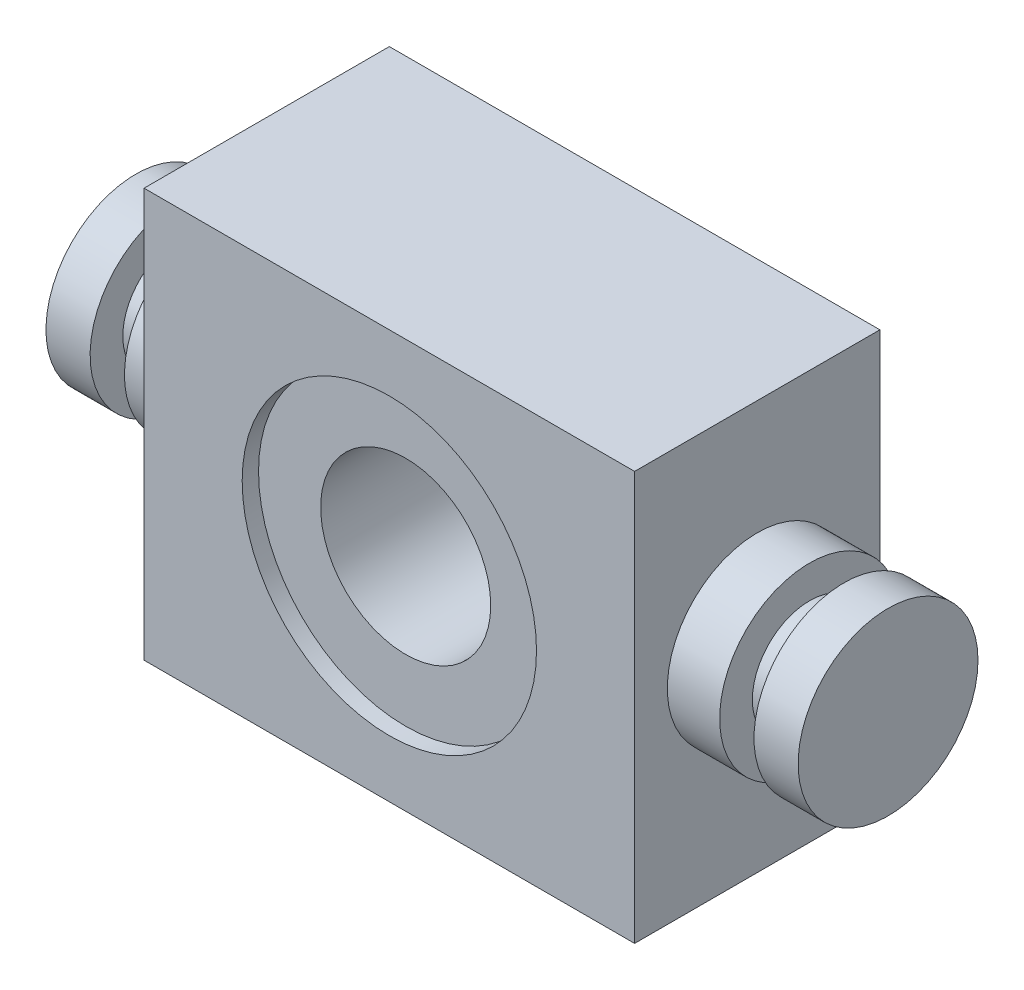
ISO-10303-21;
HEADER;
FILE_DESCRIPTION(('STEP AP214'),'2;1');
FILE_NAME('part.step','',(''),(''),'','','');
FILE_SCHEMA(('AUTOMOTIVE_DESIGN { 1 0 10303 214 1 1 1 1 }'));
ENDSEC;
DATA;
#1=APPLICATION_CONTEXT('core data for automotive mechanical design processes');
#2=APPLICATION_PROTOCOL_DEFINITION('international standard','automotive_design',2000,#1);
#3=PRODUCT_CONTEXT('',#1,'mechanical');
#4=PRODUCT('Part','Part','',(#3));
#5=PRODUCT_RELATED_PRODUCT_CATEGORY('part','',(#4));
#6=PRODUCT_DEFINITION_FORMATION('','',#4);
#7=PRODUCT_DEFINITION_CONTEXT('part definition',#1,'design');
#8=PRODUCT_DEFINITION('design','',#6,#7);
#9=PRODUCT_DEFINITION_SHAPE('','',#8);
#10=(LENGTH_UNIT() NAMED_UNIT(*) SI_UNIT(.MILLI.,.METRE.));
#11=(NAMED_UNIT(*) PLANE_ANGLE_UNIT() SI_UNIT($,.RADIAN.));
#12=(NAMED_UNIT(*) SI_UNIT($,.STERADIAN.) SOLID_ANGLE_UNIT());
#13=UNCERTAINTY_MEASURE_WITH_UNIT(LENGTH_MEASURE(1.E-05),#10,'distance_accuracy_value','');
#14=(GEOMETRIC_REPRESENTATION_CONTEXT(3) GLOBAL_UNCERTAINTY_ASSIGNED_CONTEXT((#13)) GLOBAL_UNIT_ASSIGNED_CONTEXT((#10,
#11,#12)) REPRESENTATION_CONTEXT('',''));
#15=CARTESIAN_POINT('',(0.,0.,0.));
#16=DIRECTION('',(0.,0.,1.));
#17=DIRECTION('',(1.,0.,0.));
#18=AXIS2_PLACEMENT_3D('',#15,#16,#17);
#19=CARTESIAN_POINT('',(0.,62.5,75.));
#20=DIRECTION('',(0.,-1.,0.));
#21=DIRECTION('',(1.,0.,0.));
#22=AXIS2_PLACEMENT_3D('',#19,#20,#21);
#23=PLANE('',#22);
#24=DIRECTION('',(-1.,0.,0.));
#25=VECTOR('',#24,1.);
#26=CARTESIAN_POINT('',(0.,62.5,0.));
#27=LINE('',#26,#25);
#28=CARTESIAN_POINT('',(75.,62.5,0.));
#29=VERTEX_POINT('',#28);
#30=CARTESIAN_POINT('',(-75.,62.5,0.));
#31=VERTEX_POINT('',#30);
#32=EDGE_CURVE('E116',#29,#31,#27,.T.);
#33=ORIENTED_EDGE('',*,*,#32,.T.);
#34=DIRECTION('',(0.,0.,-1.));
#35=VECTOR('',#34,1.);
#36=CARTESIAN_POINT('',(-75.,62.5,75.));
#37=LINE('',#36,#35);
#38=CARTESIAN_POINT('',(-75.,62.5,75.));
#39=VERTEX_POINT('',#38);
#40=EDGE_CURVE('E105',#39,#31,#37,.T.);
#41=ORIENTED_EDGE('',*,*,#40,.F.);
#42=DIRECTION('',(-1.,0.,0.));
#43=VECTOR('',#42,1.);
#44=CARTESIAN_POINT('',(0.,62.5,75.));
#45=LINE('',#44,#43);
#46=CARTESIAN_POINT('',(75.,62.5,75.));
#47=VERTEX_POINT('',#46);
#48=EDGE_CURVE('E97',#47,#39,#45,.T.);
#49=ORIENTED_EDGE('',*,*,#48,.F.);
#50=DIRECTION('',(0.,0.,-1.));
#51=VECTOR('',#50,1.);
#52=CARTESIAN_POINT('',(75.,62.5,75.));
#53=LINE('',#52,#51);
#54=EDGE_CURVE('E112',#47,#29,#53,.T.);
#55=ORIENTED_EDGE('',*,*,#54,.T.);
#56=EDGE_LOOP('',(#33,#41,#49,#55));
#57=FACE_BOUND('',#56,.T.);
#58=ADVANCED_FACE('F41',(#57),#23,.F.);
#59=CARTESIAN_POINT('',(-75.,0.,75.));
#60=DIRECTION('',(1.,0.,0.));
#61=DIRECTION('',(0.,1.,0.));
#62=AXIS2_PLACEMENT_3D('',#59,#60,#61);
#63=PLANE('',#62);
#64=CARTESIAN_POINT('',(-75.,0.,37.5));
#65=DIRECTION('',(-1.,0.,0.));
#66=DIRECTION('',(0.,-1.,0.));
#67=AXIS2_PLACEMENT_3D('',#64,#65,#66);
#68=CIRCLE('',#67,27.5);
#69=CARTESIAN_POINT('',(-75.,-27.5,37.5));
#70=VERTEX_POINT('',#69);
#71=EDGE_CURVE('E52',#70,#70,#68,.T.);
#72=ORIENTED_EDGE('',*,*,#71,.F.);
#73=EDGE_LOOP('',(#72));
#74=FACE_BOUND('',#73,.T.);
#75=DIRECTION('',(0.,-1.,0.));
#76=VECTOR('',#75,1.);
#77=CARTESIAN_POINT('',(-75.,0.,0.));
#78=LINE('',#77,#76);
#79=CARTESIAN_POINT('',(-75.,-62.5,0.));
#80=VERTEX_POINT('',#79);
#81=EDGE_CURVE('E103',#31,#80,#78,.T.);
#82=ORIENTED_EDGE('',*,*,#81,.T.);
#83=DIRECTION('',(0.,0.,-1.));
#84=VECTOR('',#83,1.);
#85=CARTESIAN_POINT('',(-75.,-62.5,75.));
#86=LINE('',#85,#84);
#87=CARTESIAN_POINT('',(-75.,-62.5,75.));
#88=VERTEX_POINT('',#87);
#89=EDGE_CURVE('E101',#88,#80,#86,.T.);
#90=ORIENTED_EDGE('',*,*,#89,.F.);
#91=DIRECTION('',(0.,-1.,0.));
#92=VECTOR('',#91,1.);
#93=CARTESIAN_POINT('',(-75.,0.,75.));
#94=LINE('',#93,#92);
#95=EDGE_CURVE('E92',#39,#88,#94,.T.);
#96=ORIENTED_EDGE('',*,*,#95,.F.);
#97=ORIENTED_EDGE('',*,*,#40,.T.);
#98=EDGE_LOOP('',(#82,#90,#96,#97));
#99=FACE_BOUND('',#98,.T.);
#100=ADVANCED_FACE('F102',(#74,#99),#63,.F.);
#101=CARTESIAN_POINT('',(0.,-62.5,75.));
#102=DIRECTION('',(0.,1.,0.));
#103=DIRECTION('',(-1.,0.,0.));
#104=AXIS2_PLACEMENT_3D('',#101,#102,#103);
#105=PLANE('',#104);
#106=DIRECTION('',(1.,0.,0.));
#107=VECTOR('',#106,1.);
#108=CARTESIAN_POINT('',(0.,-62.5,0.));
#109=LINE('',#108,#107);
#110=CARTESIAN_POINT('',(75.,-62.5,0.));
#111=VERTEX_POINT('',#110);
#112=EDGE_CURVE('E78',#80,#111,#109,.T.);
#113=ORIENTED_EDGE('',*,*,#112,.T.);
#114=DIRECTION('',(0.,0.,-1.));
#115=VECTOR('',#114,1.);
#116=CARTESIAN_POINT('',(75.,-62.5,75.));
#117=LINE('',#116,#115);
#118=CARTESIAN_POINT('',(75.,-62.5,75.));
#119=VERTEX_POINT('',#118);
#120=EDGE_CURVE('E106',#119,#111,#117,.T.);
#121=ORIENTED_EDGE('',*,*,#120,.F.);
#122=DIRECTION('',(1.,0.,0.));
#123=VECTOR('',#122,1.);
#124=CARTESIAN_POINT('',(0.,-62.5,75.));
#125=LINE('',#124,#123);
#126=EDGE_CURVE('E95',#88,#119,#125,.T.);
#127=ORIENTED_EDGE('',*,*,#126,.F.);
#128=ORIENTED_EDGE('',*,*,#89,.T.);
#129=EDGE_LOOP('',(#113,#121,#127,#128));
#130=FACE_BOUND('',#129,.T.);
#131=ADVANCED_FACE('F108',(#130),#105,.F.);
#132=CARTESIAN_POINT('',(0.,0.,75.));
#133=DIRECTION('',(0.,0.,-1.));
#134=DIRECTION('',(-1.,0.,0.));
#135=AXIS2_PLACEMENT_3D('',#132,#133,#134);
#136=CYLINDRICAL_SURFACE('',#135,45.);
#137=CARTESIAN_POINT('',(0.,0.,70.));
#138=DIRECTION('',(0.,0.,1.));
#139=DIRECTION('',(1.,0.,0.));
#140=AXIS2_PLACEMENT_3D('',#137,#138,#139);
#141=CIRCLE('',#140,45.);
#142=CARTESIAN_POINT('',(45.,0.,70.));
#143=VERTEX_POINT('',#142);
#144=EDGE_CURVE('E45',#143,#143,#141,.T.);
#145=ORIENTED_EDGE('',*,*,#144,.F.);
#146=EDGE_LOOP('',(#145));
#147=FACE_BOUND('',#146,.T.);
#148=CARTESIAN_POINT('',(0.,0.,75.));
#149=DIRECTION('',(0.,0.,1.));
#150=DIRECTION('',(1.,0.,0.));
#151=AXIS2_PLACEMENT_3D('',#148,#149,#150);
#152=CIRCLE('',#151,45.);
#153=CARTESIAN_POINT('',(45.,0.,75.));
#154=VERTEX_POINT('',#153);
#155=EDGE_CURVE('E127',#154,#154,#152,.T.);
#156=ORIENTED_EDGE('',*,*,#155,.T.);
#157=EDGE_LOOP('',(#156));
#158=FACE_BOUND('',#157,.T.);
#159=ADVANCED_FACE('F43',(#147,#158),#136,.F.);
#160=CARTESIAN_POINT('',(75.,0.,75.));
#161=DIRECTION('',(-1.,0.,0.));
#162=DIRECTION('',(0.,0.,1.));
#163=AXIS2_PLACEMENT_3D('',#160,#161,#162);
#164=PLANE('',#163);
#165=CARTESIAN_POINT('',(75.,0.,37.5));
#166=DIRECTION('',(1.,0.,0.));
#167=DIRECTION('',(0.,0.,-1.));
#168=AXIS2_PLACEMENT_3D('',#165,#166,#167);
#169=CIRCLE('',#168,27.5);
#170=CARTESIAN_POINT('',(75.,0.,9.99999999999999));
#171=VERTEX_POINT('',#170);
#172=EDGE_CURVE('E134',#171,#171,#169,.T.);
#173=ORIENTED_EDGE('',*,*,#172,.F.);
#174=EDGE_LOOP('',(#173));
#175=FACE_BOUND('',#174,.T.);
#176=DIRECTION('',(0.,1.,0.));
#177=VECTOR('',#176,1.);
#178=CARTESIAN_POINT('',(75.,0.,0.));
#179=LINE('',#178,#177);
#180=EDGE_CURVE('E84',#111,#29,#179,.T.);
#181=ORIENTED_EDGE('',*,*,#180,.T.);
#182=ORIENTED_EDGE('',*,*,#54,.F.);
#183=DIRECTION('',(0.,1.,0.));
#184=VECTOR('',#183,1.);
#185=CARTESIAN_POINT('',(75.,0.,75.));
#186=LINE('',#185,#184);
#187=EDGE_CURVE('E61',#119,#47,#186,.T.);
#188=ORIENTED_EDGE('',*,*,#187,.F.);
#189=ORIENTED_EDGE('',*,*,#120,.T.);
#190=EDGE_LOOP('',(#181,#182,#188,#189));
#191=FACE_BOUND('',#190,.T.);
#192=ADVANCED_FACE('F207',(#175,#191),#164,.F.);
#193=CARTESIAN_POINT('',(0.,0.,75.));
#194=DIRECTION('',(0.,0.,1.));
#195=DIRECTION('',(1.,0.,0.));
#196=AXIS2_PLACEMENT_3D('',#193,#194,#195);
#197=PLANE('',#196);
#198=ORIENTED_EDGE('',*,*,#155,.F.);
#199=EDGE_LOOP('',(#198));
#200=FACE_BOUND('',#199,.T.);
#201=ORIENTED_EDGE('',*,*,#48,.T.);
#202=ORIENTED_EDGE('',*,*,#95,.T.);
#203=ORIENTED_EDGE('',*,*,#126,.T.);
#204=ORIENTED_EDGE('',*,*,#187,.T.);
#205=EDGE_LOOP('',(#201,#202,#203,#204));
#206=FACE_BOUND('',#205,.T.);
#207=ADVANCED_FACE('F93',(#200,#206),#197,.T.);
#208=CARTESIAN_POINT('',(0.,0.,0.));
#209=DIRECTION('',(0.,0.,1.));
#210=DIRECTION('',(1.,0.,0.));
#211=AXIS2_PLACEMENT_3D('',#208,#209,#210);
#212=PLANE('',#211);
#213=ORIENTED_EDGE('',*,*,#32,.F.);
#214=ORIENTED_EDGE('',*,*,#180,.F.);
#215=ORIENTED_EDGE('',*,*,#112,.F.);
#216=ORIENTED_EDGE('',*,*,#81,.F.);
#217=EDGE_LOOP('',(#213,#214,#215,#216));
#218=FACE_BOUND('',#217,.T.);
#219=CARTESIAN_POINT('',(0.,0.,0.));
#220=DIRECTION('',(0.,0.,1.));
#221=DIRECTION('',(1.,0.,0.));
#222=AXIS2_PLACEMENT_3D('',#219,#220,#221);
#223=CIRCLE('',#222,26.);
#224=CARTESIAN_POINT('',(26.,0.,0.));
#225=VERTEX_POINT('',#224);
#226=EDGE_CURVE('E152',#225,#225,#223,.T.);
#227=ORIENTED_EDGE('',*,*,#226,.T.);
#228=EDGE_LOOP('',(#227));
#229=FACE_BOUND('',#228,.T.);
#230=ADVANCED_FACE('F211',(#218,#229),#212,.F.);
#231=CARTESIAN_POINT('',(0.,0.,70.));
#232=DIRECTION('',(0.,0.,-1.));
#233=DIRECTION('',(-1.,0.,0.));
#234=AXIS2_PLACEMENT_3D('',#231,#232,#233);
#235=CYLINDRICAL_SURFACE('',#234,26.);
#236=CARTESIAN_POINT('',(0.,0.,70.));
#237=DIRECTION('',(0.,0.,1.));
#238=DIRECTION('',(1.,0.,0.));
#239=AXIS2_PLACEMENT_3D('',#236,#237,#238);
#240=CIRCLE('',#239,26.);
#241=CARTESIAN_POINT('',(26.,0.,70.));
#242=VERTEX_POINT('',#241);
#243=EDGE_CURVE('E120',#242,#242,#240,.T.);
#244=ORIENTED_EDGE('',*,*,#243,.T.);
#245=EDGE_LOOP('',(#244));
#246=FACE_BOUND('',#245,.T.);
#247=ORIENTED_EDGE('',*,*,#226,.F.);
#248=EDGE_LOOP('',(#247));
#249=FACE_BOUND('',#248,.T.);
#250=ADVANCED_FACE('F214',(#246,#249),#235,.F.);
#251=CARTESIAN_POINT('',(0.,0.,70.));
#252=DIRECTION('',(0.,0.,1.));
#253=DIRECTION('',(1.,0.,0.));
#254=AXIS2_PLACEMENT_3D('',#251,#252,#253);
#255=PLANE('',#254);
#256=ORIENTED_EDGE('',*,*,#243,.F.);
#257=EDGE_LOOP('',(#256));
#258=FACE_BOUND('',#257,.T.);
#259=ORIENTED_EDGE('',*,*,#144,.T.);
#260=EDGE_LOOP('',(#259));
#261=FACE_BOUND('',#260,.T.);
#262=ADVANCED_FACE('F221',(#258,#261),#255,.T.);
#263=CARTESIAN_POINT('',(91.,0.,37.5));
#264=DIRECTION('',(-1.,0.,0.));
#265=DIRECTION('',(0.,0.,1.));
#266=AXIS2_PLACEMENT_3D('',#263,#264,#265);
#267=CYLINDRICAL_SURFACE('',#266,27.5);
#268=CARTESIAN_POINT('',(91.,0.,37.5));
#269=DIRECTION('',(1.,0.,0.));
#270=DIRECTION('',(0.,0.,-1.));
#271=AXIS2_PLACEMENT_3D('',#268,#269,#270);
#272=CIRCLE('',#271,27.5);
#273=CARTESIAN_POINT('',(91.,0.,9.99999999999999));
#274=VERTEX_POINT('',#273);
#275=EDGE_CURVE('E148',#274,#274,#272,.T.);
#276=ORIENTED_EDGE('',*,*,#275,.F.);
#277=EDGE_LOOP('',(#276));
#278=FACE_BOUND('',#277,.T.);
#279=ORIENTED_EDGE('',*,*,#172,.T.);
#280=EDGE_LOOP('',(#279));
#281=FACE_BOUND('',#280,.T.);
#282=ADVANCED_FACE('F225',(#278,#281),#267,.T.);
#283=CARTESIAN_POINT('',(91.,0.,37.5));
#284=DIRECTION('',(1.,0.,0.));
#285=DIRECTION('',(0.,0.,-1.));
#286=AXIS2_PLACEMENT_3D('',#283,#284,#285);
#287=PLANE('',#286);
#288=CARTESIAN_POINT('',(91.,0.,37.5));
#289=DIRECTION('',(1.,0.,0.));
#290=DIRECTION('',(0.,0.,-1.));
#291=AXIS2_PLACEMENT_3D('',#288,#289,#290);
#292=CIRCLE('',#291,17.5);
#293=CARTESIAN_POINT('',(91.,0.,55.));
#294=VERTEX_POINT('',#293);
#295=EDGE_CURVE('E139',#294,#294,#292,.T.);
#296=ORIENTED_EDGE('',*,*,#295,.F.);
#297=EDGE_LOOP('',(#296));
#298=FACE_BOUND('',#297,.T.);
#299=ORIENTED_EDGE('',*,*,#275,.T.);
#300=EDGE_LOOP('',(#299));
#301=FACE_BOUND('',#300,.T.);
#302=ADVANCED_FACE('F229',(#298,#301),#287,.T.);
#303=CARTESIAN_POINT('',(101.5,0.,37.5));
#304=DIRECTION('',(-1.,0.,0.));
#305=DIRECTION('',(0.,0.,1.));
#306=AXIS2_PLACEMENT_3D('',#303,#304,#305);
#307=CYLINDRICAL_SURFACE('',#306,17.5);
#308=CARTESIAN_POINT('',(101.5,0.,37.5));
#309=DIRECTION('',(1.,0.,0.));
#310=DIRECTION('',(0.,0.,-1.));
#311=AXIS2_PLACEMENT_3D('',#308,#309,#310);
#312=CIRCLE('',#311,17.5);
#313=CARTESIAN_POINT('',(101.5,0.,55.));
#314=VERTEX_POINT('',#313);
#315=EDGE_CURVE('E162',#314,#314,#312,.T.);
#316=CARTESIAN_POINT('',(101.5,0.,55.));
#317=CARTESIAN_POINT('',(101.390625,0.,55.));
#318=CARTESIAN_POINT('',(101.28125,0.,55.));
#319=CARTESIAN_POINT('',(101.0625,0.,55.));
#320=CARTESIAN_POINT('',(100.953125,0.,55.));
#321=CARTESIAN_POINT('',(100.734375,0.,55.));
#322=CARTESIAN_POINT('',(100.625,0.,55.));
#323=CARTESIAN_POINT('',(100.40625,0.,55.));
#324=CARTESIAN_POINT('',(100.296875,0.,55.));
#325=CARTESIAN_POINT('',(100.078125,0.,55.));
#326=CARTESIAN_POINT('',(99.96875,0.,55.));
#327=CARTESIAN_POINT('',(99.75,0.,55.));
#328=CARTESIAN_POINT('',(99.640625,0.,55.));
#329=CARTESIAN_POINT('',(99.421875,0.,55.));
#330=CARTESIAN_POINT('',(99.3125,0.,55.));
#331=CARTESIAN_POINT('',(99.09375,0.,55.));
#332=CARTESIAN_POINT('',(98.984375,0.,55.));
#333=CARTESIAN_POINT('',(98.765625,0.,55.));
#334=CARTESIAN_POINT('',(98.65625,0.,55.));
#335=CARTESIAN_POINT('',(98.4375,0.,55.));
#336=CARTESIAN_POINT('',(98.328125,0.,55.));
#337=CARTESIAN_POINT('',(98.109375,0.,55.));
#338=CARTESIAN_POINT('',(98.,0.,55.));
#339=CARTESIAN_POINT('',(97.78125,0.,55.));
#340=CARTESIAN_POINT('',(97.671875,0.,55.));
#341=CARTESIAN_POINT('',(97.453125,0.,55.));
#342=CARTESIAN_POINT('',(97.34375,0.,55.));
#343=CARTESIAN_POINT('',(97.125,0.,55.));
#344=CARTESIAN_POINT('',(97.015625,0.,55.));
#345=CARTESIAN_POINT('',(96.796875,0.,55.));
#346=CARTESIAN_POINT('',(96.6875,0.,55.));
#347=CARTESIAN_POINT('',(96.46875,0.,55.));
#348=CARTESIAN_POINT('',(96.359375,0.,55.));
#349=CARTESIAN_POINT('',(96.140625,0.,55.));
#350=CARTESIAN_POINT('',(96.03125,0.,55.));
#351=CARTESIAN_POINT('',(95.8125,0.,55.));
#352=CARTESIAN_POINT('',(95.703125,0.,55.));
#353=CARTESIAN_POINT('',(95.484375,0.,55.));
#354=CARTESIAN_POINT('',(95.375,0.,55.));
#355=CARTESIAN_POINT('',(95.15625,0.,55.));
#356=CARTESIAN_POINT('',(95.046875,0.,55.));
#357=CARTESIAN_POINT('',(94.828125,0.,55.));
#358=CARTESIAN_POINT('',(94.71875,0.,55.));
#359=CARTESIAN_POINT('',(94.5,0.,55.));
#360=CARTESIAN_POINT('',(94.390625,0.,55.));
#361=CARTESIAN_POINT('',(94.171875,0.,55.));
#362=CARTESIAN_POINT('',(94.0625,0.,55.));
#363=CARTESIAN_POINT('',(93.84375,0.,55.));
#364=CARTESIAN_POINT('',(93.734375,0.,55.));
#365=CARTESIAN_POINT('',(93.515625,0.,55.));
#366=CARTESIAN_POINT('',(93.40625,0.,55.));
#367=CARTESIAN_POINT('',(93.1875,0.,55.));
#368=CARTESIAN_POINT('',(93.078125,0.,55.));
#369=CARTESIAN_POINT('',(92.859375,0.,55.));
#370=CARTESIAN_POINT('',(92.75,0.,55.));
#371=CARTESIAN_POINT('',(92.53125,0.,55.));
#372=CARTESIAN_POINT('',(92.421875,0.,55.));
#373=CARTESIAN_POINT('',(92.203125,0.,55.));
#374=CARTESIAN_POINT('',(92.09375,0.,55.));
#375=CARTESIAN_POINT('',(91.875,0.,55.));
#376=CARTESIAN_POINT('',(91.765625,0.,55.));
#377=CARTESIAN_POINT('',(91.546875,0.,55.));
#378=CARTESIAN_POINT('',(91.4375,0.,55.));
#379=CARTESIAN_POINT('',(91.21875,0.,55.));
#380=CARTESIAN_POINT('',(91.109375,0.,55.));
#381=CARTESIAN_POINT('',(91.,0.,55.));
#382=B_SPLINE_CURVE_WITH_KNOTS('',3,(#316,#317,#318,#319,#320,#321,#322,#323,#324,#325,#326,
#327,#328,#329,#330,#331,#332,#333,#334,#335,#336,#337,#338,#339,#340,#341,#342,#343,#344,#345,
#346,#347,#348,#349,#350,#351,#352,#353,#354,#355,#356,#357,#358,#359,#360,#361,#362,#363,#364,
#365,#366,#367,#368,#369,#370,#371,#372,#373,#374,#375,#376,#377,#378,#379,#380,#381),
.UNSPECIFIED.,.F.,.F.,(4,2,2,2,2,2,2,2,2,2,2,2,2,2,2,2,2,2,2,2,2,2,2,2,2,2,2,2,2,2,2,2,4),(0.,
0.328125000000012,0.656250000000011,0.98437500000001,1.31250000000001,1.64062500000001,
1.96875000000001,2.296875,2.625,2.953125,3.28125,3.609375,3.93750000000001,4.26562500000001,
4.59375000000001,4.92187500000001,5.25,5.578125,5.90625,6.234375,6.5625,6.890625,7.21875,
7.54687500000001,7.87500000000001,8.20312500000001,8.53125,8.859375,9.1875,9.515625,9.84375,
10.171875,10.5),.UNSPECIFIED.);
#383=EDGE_CURVE('BSEAM233',#314,#294,#382,.T.);
#384=ORIENTED_EDGE('',*,*,#315,.F.);
#385=ORIENTED_EDGE('',*,*,#295,.T.);
#386=ORIENTED_EDGE('',*,*,#383,.T.);
#387=ORIENTED_EDGE('',*,*,#383,.F.);
#388=EDGE_LOOP('',(#384,#386,#385,#387));
#389=FACE_BOUND('',#388,.T.);
#390=ADVANCED_FACE('F233',(#389),#307,.T.);
#391=CARTESIAN_POINT('',(115.,0.,37.5));
#392=DIRECTION('',(-1.,0.,0.));
#393=DIRECTION('',(0.,0.,1.));
#394=AXIS2_PLACEMENT_3D('',#391,#392,#393);
#395=CYLINDRICAL_SURFACE('',#394,27.5);
#396=CARTESIAN_POINT('',(115.,0.,37.5));
#397=DIRECTION('',(1.,0.,0.));
#398=DIRECTION('',(0.,0.,-1.));
#399=AXIS2_PLACEMENT_3D('',#396,#397,#398);
#400=CIRCLE('',#399,27.5);
#401=CARTESIAN_POINT('',(115.,0.,9.99999999999999));
#402=VERTEX_POINT('',#401);
#403=EDGE_CURVE('E165',#402,#402,#400,.T.);
#404=ORIENTED_EDGE('',*,*,#403,.F.);
#405=EDGE_LOOP('',(#404));
#406=FACE_BOUND('',#405,.T.);
#407=CARTESIAN_POINT('',(101.5,0.,37.5));
#408=DIRECTION('',(1.,0.,0.));
#409=DIRECTION('',(0.,0.,-1.));
#410=AXIS2_PLACEMENT_3D('',#407,#408,#409);
#411=CIRCLE('',#410,27.5);
#412=CARTESIAN_POINT('',(101.5,0.,9.99999999999999));
#413=VERTEX_POINT('',#412);
#414=EDGE_CURVE('E169',#413,#413,#411,.T.);
#415=ORIENTED_EDGE('',*,*,#414,.T.);
#416=EDGE_LOOP('',(#415));
#417=FACE_BOUND('',#416,.T.);
#418=ADVANCED_FACE('F237',(#406,#417),#395,.T.);
#419=CARTESIAN_POINT('',(115.,0.,37.5));
#420=DIRECTION('',(1.,0.,0.));
#421=DIRECTION('',(0.,0.,-1.));
#422=AXIS2_PLACEMENT_3D('',#419,#420,#421);
#423=PLANE('',#422);
#424=ORIENTED_EDGE('',*,*,#403,.T.);
#425=EDGE_LOOP('',(#424));
#426=FACE_BOUND('',#425,.T.);
#427=ADVANCED_FACE('F241',(#426),#423,.T.);
#428=CARTESIAN_POINT('',(101.5,0.,37.5));
#429=DIRECTION('',(1.,0.,0.));
#430=DIRECTION('',(0.,0.,-1.));
#431=AXIS2_PLACEMENT_3D('',#428,#429,#430);
#432=PLANE('',#431);
#433=ORIENTED_EDGE('',*,*,#315,.T.);
#434=EDGE_LOOP('',(#433));
#435=FACE_BOUND('',#434,.T.);
#436=ORIENTED_EDGE('',*,*,#414,.F.);
#437=EDGE_LOOP('',(#436));
#438=FACE_BOUND('',#437,.T.);
#439=ADVANCED_FACE('F243',(#435,#438),#432,.F.);
#440=CARTESIAN_POINT('',(-91.,0.,37.5));
#441=DIRECTION('',(1.,0.,0.));
#442=DIRECTION('',(0.,1.,0.));
#443=AXIS2_PLACEMENT_3D('',#440,#441,#442);
#444=CYLINDRICAL_SURFACE('',#443,27.5);
#445=CARTESIAN_POINT('',(-91.,0.,37.5));
#446=DIRECTION('',(-1.,0.,0.));
#447=DIRECTION('',(0.,-1.,0.));
#448=AXIS2_PLACEMENT_3D('',#445,#446,#447);
#449=CIRCLE('',#448,27.5);
#450=CARTESIAN_POINT('',(-91.,-27.5,37.5));
#451=VERTEX_POINT('',#450);
#452=EDGE_CURVE('E173',#451,#451,#449,.T.);
#453=ORIENTED_EDGE('',*,*,#452,.F.);
#454=EDGE_LOOP('',(#453));
#455=FACE_BOUND('',#454,.T.);
#456=ORIENTED_EDGE('',*,*,#71,.T.);
#457=EDGE_LOOP('',(#456));
#458=FACE_BOUND('',#457,.T.);
#459=ADVANCED_FACE('F196',(#455,#458),#444,.T.);
#460=CARTESIAN_POINT('',(-91.,0.,37.5));
#461=DIRECTION('',(-1.,0.,0.));
#462=DIRECTION('',(0.,-1.,0.));
#463=AXIS2_PLACEMENT_3D('',#460,#461,#462);
#464=PLANE('',#463);
#465=CARTESIAN_POINT('',(-91.,0.,37.5));
#466=DIRECTION('',(-1.,0.,0.));
#467=DIRECTION('',(0.,-1.,0.));
#468=AXIS2_PLACEMENT_3D('',#465,#466,#467);
#469=CIRCLE('',#468,17.5);
#470=CARTESIAN_POINT('',(-91.,17.5,37.5));
#471=VERTEX_POINT('',#470);
#472=EDGE_CURVE('E11',#471,#471,#469,.T.);
#473=ORIENTED_EDGE('',*,*,#472,.F.);
#474=EDGE_LOOP('',(#473));
#475=FACE_BOUND('',#474,.T.);
#476=ORIENTED_EDGE('',*,*,#452,.T.);
#477=EDGE_LOOP('',(#476));
#478=FACE_BOUND('',#477,.T.);
#479=ADVANCED_FACE('F252',(#475,#478),#464,.T.);
#480=CARTESIAN_POINT('',(-101.5,0.,37.5));
#481=DIRECTION('',(1.,0.,0.));
#482=DIRECTION('',(0.,1.,0.));
#483=AXIS2_PLACEMENT_3D('',#480,#481,#482);
#484=CYLINDRICAL_SURFACE('',#483,17.5);
#485=CARTESIAN_POINT('',(-101.5,0.,37.5));
#486=DIRECTION('',(-1.,0.,0.));
#487=DIRECTION('',(0.,-1.,0.));
#488=AXIS2_PLACEMENT_3D('',#485,#486,#487);
#489=CIRCLE('',#488,17.5);
#490=CARTESIAN_POINT('',(-101.5,17.5,37.5));
#491=VERTEX_POINT('',#490);
#492=EDGE_CURVE('E177',#491,#491,#489,.T.);
#493=CARTESIAN_POINT('',(-101.5,17.5,37.5));
#494=CARTESIAN_POINT('',(-101.390625,17.5,37.5));
#495=CARTESIAN_POINT('',(-101.28125,17.5,37.5));
#496=CARTESIAN_POINT('',(-101.0625,17.5,37.5));
#497=CARTESIAN_POINT('',(-100.953125,17.5,37.5));
#498=CARTESIAN_POINT('',(-100.734375,17.5,37.5));
#499=CARTESIAN_POINT('',(-100.625,17.5,37.5));
#500=CARTESIAN_POINT('',(-100.40625,17.5,37.5));
#501=CARTESIAN_POINT('',(-100.296875,17.5,37.5));
#502=CARTESIAN_POINT('',(-100.078125,17.5,37.5));
#503=CARTESIAN_POINT('',(-99.96875,17.5,37.5));
#504=CARTESIAN_POINT('',(-99.75,17.5,37.5));
#505=CARTESIAN_POINT('',(-99.640625,17.5,37.5));
#506=CARTESIAN_POINT('',(-99.421875,17.5,37.5));
#507=CARTESIAN_POINT('',(-99.3125,17.5,37.5));
#508=CARTESIAN_POINT('',(-99.09375,17.5,37.5));
#509=CARTESIAN_POINT('',(-98.984375,17.5,37.5));
#510=CARTESIAN_POINT('',(-98.765625,17.5,37.5));
#511=CARTESIAN_POINT('',(-98.65625,17.5,37.5));
#512=CARTESIAN_POINT('',(-98.4375,17.5,37.5));
#513=CARTESIAN_POINT('',(-98.328125,17.5,37.5));
#514=CARTESIAN_POINT('',(-98.109375,17.5,37.5));
#515=CARTESIAN_POINT('',(-98.,17.5,37.5));
#516=CARTESIAN_POINT('',(-97.78125,17.5,37.5));
#517=CARTESIAN_POINT('',(-97.671875,17.5,37.5));
#518=CARTESIAN_POINT('',(-97.453125,17.5,37.5));
#519=CARTESIAN_POINT('',(-97.34375,17.5,37.5));
#520=CARTESIAN_POINT('',(-97.125,17.5,37.5));
#521=CARTESIAN_POINT('',(-97.015625,17.5,37.5));
#522=CARTESIAN_POINT('',(-96.796875,17.5,37.5));
#523=CARTESIAN_POINT('',(-96.6875,17.5,37.5));
#524=CARTESIAN_POINT('',(-96.46875,17.5,37.5));
#525=CARTESIAN_POINT('',(-96.359375,17.5,37.5));
#526=CARTESIAN_POINT('',(-96.140625,17.5,37.5));
#527=CARTESIAN_POINT('',(-96.03125,17.5,37.5));
#528=CARTESIAN_POINT('',(-95.8125,17.5,37.5));
#529=CARTESIAN_POINT('',(-95.703125,17.5,37.5));
#530=CARTESIAN_POINT('',(-95.484375,17.5,37.5));
#531=CARTESIAN_POINT('',(-95.375,17.5,37.5));
#532=CARTESIAN_POINT('',(-95.15625,17.5,37.5));
#533=CARTESIAN_POINT('',(-95.046875,17.5,37.5));
#534=CARTESIAN_POINT('',(-94.828125,17.5,37.5));
#535=CARTESIAN_POINT('',(-94.71875,17.5,37.5));
#536=CARTESIAN_POINT('',(-94.5,17.5,37.5));
#537=CARTESIAN_POINT('',(-94.390625,17.5,37.5));
#538=CARTESIAN_POINT('',(-94.171875,17.5,37.5));
#539=CARTESIAN_POINT('',(-94.0625,17.5,37.5));
#540=CARTESIAN_POINT('',(-93.84375,17.5,37.5));
#541=CARTESIAN_POINT('',(-93.734375,17.5,37.5));
#542=CARTESIAN_POINT('',(-93.515625,17.5,37.5));
#543=CARTESIAN_POINT('',(-93.40625,17.5,37.5));
#544=CARTESIAN_POINT('',(-93.1875,17.5,37.5));
#545=CARTESIAN_POINT('',(-93.078125,17.5,37.5));
#546=CARTESIAN_POINT('',(-92.859375,17.5,37.5));
#547=CARTESIAN_POINT('',(-92.75,17.5,37.5));
#548=CARTESIAN_POINT('',(-92.53125,17.5,37.5));
#549=CARTESIAN_POINT('',(-92.421875,17.5,37.5));
#550=CARTESIAN_POINT('',(-92.203125,17.5,37.5));
#551=CARTESIAN_POINT('',(-92.09375,17.5,37.5));
#552=CARTESIAN_POINT('',(-91.875,17.5,37.5));
#553=CARTESIAN_POINT('',(-91.765625,17.5,37.5));
#554=CARTESIAN_POINT('',(-91.546875,17.5,37.5));
#555=CARTESIAN_POINT('',(-91.4375,17.5,37.5));
#556=CARTESIAN_POINT('',(-91.21875,17.5,37.5));
#557=CARTESIAN_POINT('',(-91.109375,17.5,37.5));
#558=CARTESIAN_POINT('',(-91.,17.5,37.5));
#559=B_SPLINE_CURVE_WITH_KNOTS('',3,(#493,#494,#495,#496,#497,#498,#499,#500,#501,#502,#503,
#504,#505,#506,#507,#508,#509,#510,#511,#512,#513,#514,#515,#516,#517,#518,#519,#520,#521,#522,
#523,#524,#525,#526,#527,#528,#529,#530,#531,#532,#533,#534,#535,#536,#537,#538,#539,#540,#541,
#542,#543,#544,#545,#546,#547,#548,#549,#550,#551,#552,#553,#554,#555,#556,#557,#558),
.UNSPECIFIED.,.F.,.F.,(4,2,2,2,2,2,2,2,2,2,2,2,2,2,2,2,2,2,2,2,2,2,2,2,2,2,2,2,2,2,2,2,4),(0.,
0.328125000000012,0.656250000000011,0.98437500000001,1.31250000000001,1.64062500000001,
1.96875000000001,2.296875,2.625,2.953125,3.28125,3.60937500000001,3.93750000000001,
4.26562500000001,4.59375000000001,4.92187500000001,5.25,5.578125,5.90625,6.234375,6.5625,
6.89062500000001,7.21875000000001,7.54687500000001,7.87500000000001,8.20312500000001,8.53125,
8.859375,9.1875,9.515625,9.84375,10.171875,10.5),.UNSPECIFIED.);
#560=EDGE_CURVE('BSEAM256',#491,#471,#559,.T.);
#561=ORIENTED_EDGE('',*,*,#492,.F.);
#562=ORIENTED_EDGE('',*,*,#472,.T.);
#563=ORIENTED_EDGE('',*,*,#560,.T.);
#564=ORIENTED_EDGE('',*,*,#560,.F.);
#565=EDGE_LOOP('',(#561,#563,#562,#564));
#566=FACE_BOUND('',#565,.T.);
#567=ADVANCED_FACE('F256',(#566),#484,.T.);
#568=CARTESIAN_POINT('',(-115.,0.,37.5));
#569=DIRECTION('',(1.,0.,0.));
#570=DIRECTION('',(0.,1.,0.));
#571=AXIS2_PLACEMENT_3D('',#568,#569,#570);
#572=CYLINDRICAL_SURFACE('',#571,27.5);
#573=CARTESIAN_POINT('',(-115.,0.,37.5));
#574=DIRECTION('',(-1.,0.,0.));
#575=DIRECTION('',(0.,-1.,0.));
#576=AXIS2_PLACEMENT_3D('',#573,#574,#575);
#577=CIRCLE('',#576,27.5);
#578=CARTESIAN_POINT('',(-115.,-27.5,37.5));
#579=VERTEX_POINT('',#578);
#580=EDGE_CURVE('E181',#579,#579,#577,.T.);
#581=ORIENTED_EDGE('',*,*,#580,.F.);
#582=EDGE_LOOP('',(#581));
#583=FACE_BOUND('',#582,.T.);
#584=CARTESIAN_POINT('',(-101.5,0.,37.5));
#585=DIRECTION('',(-1.,0.,0.));
#586=DIRECTION('',(0.,-1.,0.));
#587=AXIS2_PLACEMENT_3D('',#584,#585,#586);
#588=CIRCLE('',#587,27.5);
#589=CARTESIAN_POINT('',(-101.5,-27.5,37.5));
#590=VERTEX_POINT('',#589);
#591=EDGE_CURVE('E185',#590,#590,#588,.T.);
#592=ORIENTED_EDGE('',*,*,#591,.T.);
#593=EDGE_LOOP('',(#592));
#594=FACE_BOUND('',#593,.T.);
#595=ADVANCED_FACE('F260',(#583,#594),#572,.T.);
#596=CARTESIAN_POINT('',(-115.,0.,37.5));
#597=DIRECTION('',(-1.,0.,0.));
#598=DIRECTION('',(0.,-1.,0.));
#599=AXIS2_PLACEMENT_3D('',#596,#597,#598);
#600=PLANE('',#599);
#601=ORIENTED_EDGE('',*,*,#580,.T.);
#602=EDGE_LOOP('',(#601));
#603=FACE_BOUND('',#602,.T.);
#604=ADVANCED_FACE('F264',(#603),#600,.T.);
#605=CARTESIAN_POINT('',(-101.5,0.,37.5));
#606=DIRECTION('',(-1.,0.,0.));
#607=DIRECTION('',(0.,-1.,0.));
#608=AXIS2_PLACEMENT_3D('',#605,#606,#607);
#609=PLANE('',#608);
#610=ORIENTED_EDGE('',*,*,#492,.T.);
#611=EDGE_LOOP('',(#610));
#612=FACE_BOUND('',#611,.T.);
#613=ORIENTED_EDGE('',*,*,#591,.F.);
#614=EDGE_LOOP('',(#613));
#615=FACE_BOUND('',#614,.T.);
#616=ADVANCED_FACE('F266',(#612,#615),#609,.F.);
#617=CLOSED_SHELL('',(#58,#100,#131,#159,#192,#207,#230,#250,#262,#282,#302,#390,#418,#427,#439,
#459,#479,#567,#595,#604,#616));
#618=MANIFOLD_SOLID_BREP('B2',#617);
#619=ADVANCED_BREP_SHAPE_REPRESENTATION('',(#18,#618),#14);
#620=SHAPE_DEFINITION_REPRESENTATION(#9,#619);
ENDSEC;
END-ISO-10303-21;
